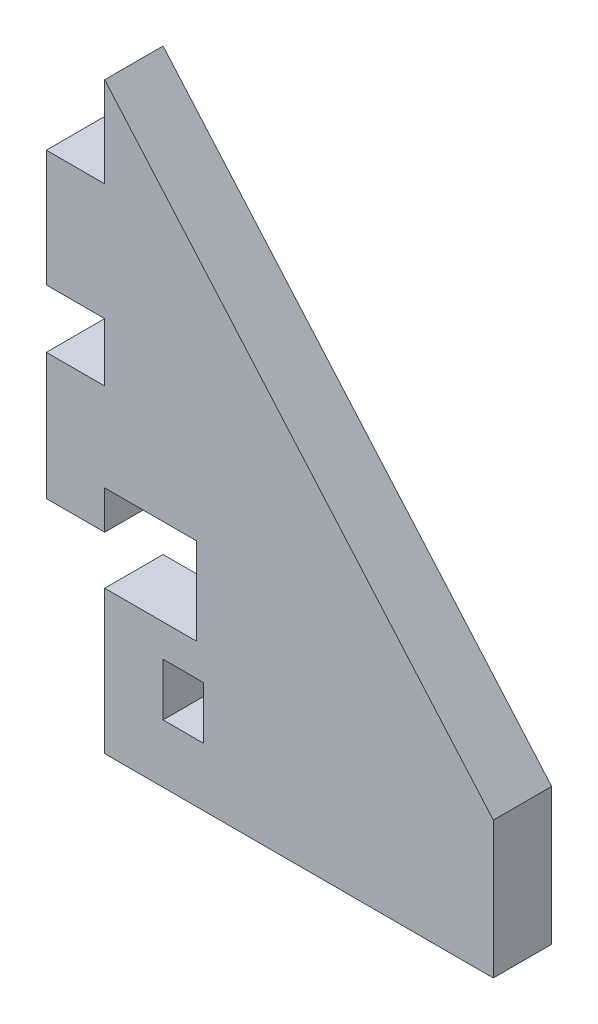
ISO-10303-21;
HEADER;
FILE_DESCRIPTION(('STEP AP214'),'2;1');
FILE_NAME('part.step','',(''),(''),'','','');
FILE_SCHEMA(('AUTOMOTIVE_DESIGN { 1 0 10303 214 1 1 1 1 }'));
ENDSEC;
DATA;
#1=APPLICATION_CONTEXT('core data for automotive mechanical design processes');
#2=APPLICATION_PROTOCOL_DEFINITION('international standard','automotive_design',2000,#1);
#3=PRODUCT_CONTEXT('',#1,'mechanical');
#4=PRODUCT('Part','Part','',(#3));
#5=PRODUCT_RELATED_PRODUCT_CATEGORY('part','',(#4));
#6=PRODUCT_DEFINITION_FORMATION('','',#4);
#7=PRODUCT_DEFINITION_CONTEXT('part definition',#1,'design');
#8=PRODUCT_DEFINITION('design','',#6,#7);
#9=PRODUCT_DEFINITION_SHAPE('','',#8);
#10=(LENGTH_UNIT() NAMED_UNIT(*) SI_UNIT(.MILLI.,.METRE.));
#11=(NAMED_UNIT(*) PLANE_ANGLE_UNIT() SI_UNIT($,.RADIAN.));
#12=(NAMED_UNIT(*) SI_UNIT($,.STERADIAN.) SOLID_ANGLE_UNIT());
#13=UNCERTAINTY_MEASURE_WITH_UNIT(LENGTH_MEASURE(1.E-05),#10,'distance_accuracy_value','');
#14=(GEOMETRIC_REPRESENTATION_CONTEXT(3) GLOBAL_UNCERTAINTY_ASSIGNED_CONTEXT((#13)) GLOBAL_UNIT_ASSIGNED_CONTEXT((#10,
#11,#12)) REPRESENTATION_CONTEXT('',''));
#15=CARTESIAN_POINT('',(0.,0.,0.));
#16=DIRECTION('',(0.,0.,1.));
#17=DIRECTION('',(1.,0.,0.));
#18=AXIS2_PLACEMENT_3D('',#15,#16,#17);
#19=CARTESIAN_POINT('',(-12.3466761252819,47.9124999999994,6.35));
#20=DIRECTION('',(1.,0.,0.));
#21=DIRECTION('',(0.,1.,0.));
#22=AXIS2_PLACEMENT_3D('',#19,#20,#21);
#23=PLANE('',#22);
#24=DIRECTION('',(0.,-1.,0.));
#25=VECTOR('',#24,1.);
#26=CARTESIAN_POINT('',(-12.3466761252819,47.9124999999994,0.));
#27=LINE('',#26,#25);
#28=CARTESIAN_POINT('',(-12.3466761252819,47.9124999999994,0.));
#29=VERTEX_POINT('',#28);
#30=CARTESIAN_POINT('',(-12.3466761252819,38.1,0.));
#31=VERTEX_POINT('',#30);
#32=EDGE_CURVE('E202',#29,#31,#27,.T.);
#33=ORIENTED_EDGE('',*,*,#32,.T.);
#34=DIRECTION('',(0.,0.,-1.));
#35=VECTOR('',#34,1.);
#36=CARTESIAN_POINT('',(-12.3466761252819,38.1,6.35));
#37=LINE('',#36,#35);
#38=CARTESIAN_POINT('',(-12.3466761252819,38.1,6.35));
#39=VERTEX_POINT('',#38);
#40=EDGE_CURVE('E11',#39,#31,#37,.T.);
#41=ORIENTED_EDGE('',*,*,#40,.F.);
#42=DIRECTION('',(0.,-1.,0.));
#43=VECTOR('',#42,1.);
#44=CARTESIAN_POINT('',(-12.3466761252819,47.9124999999994,6.35));
#45=LINE('',#44,#43);
#46=CARTESIAN_POINT('',(-12.3466761252819,47.9124999999994,6.35));
#47=VERTEX_POINT('',#46);
#48=EDGE_CURVE('E206',#47,#39,#45,.T.);
#49=ORIENTED_EDGE('',*,*,#48,.F.);
#50=DIRECTION('',(0.,0.,-1.));
#51=VECTOR('',#50,1.);
#52=CARTESIAN_POINT('',(-12.3466761252819,47.9124999999994,6.35));
#53=LINE('',#52,#51);
#54=EDGE_CURVE('E240',#47,#29,#53,.T.);
#55=ORIENTED_EDGE('',*,*,#54,.T.);
#56=EDGE_LOOP('',(#33,#41,#49,#55));
#57=FACE_BOUND('',#56,.T.);
#58=ADVANCED_FACE('F33',(#57),#23,.F.);
#59=CARTESIAN_POINT('',(-12.3466761252819,38.1,6.35));
#60=DIRECTION('',(0.,-1.,0.));
#61=DIRECTION('',(1.,0.,0.));
#62=AXIS2_PLACEMENT_3D('',#59,#60,#61);
#63=PLANE('',#62);
#64=DIRECTION('',(-1.,0.,0.));
#65=VECTOR('',#64,1.);
#66=CARTESIAN_POINT('',(-12.3466761252819,38.1,0.));
#67=LINE('',#66,#65);
#68=CARTESIAN_POINT('',(-18.6966761252819,38.1,0.));
#69=VERTEX_POINT('',#68);
#70=EDGE_CURVE('E243',#31,#69,#67,.T.);
#71=ORIENTED_EDGE('',*,*,#70,.T.);
#72=DIRECTION('',(0.,0.,-1.));
#73=VECTOR('',#72,1.);
#74=CARTESIAN_POINT('',(-18.6966761252819,38.1,6.35));
#75=LINE('',#74,#73);
#76=CARTESIAN_POINT('',(-18.6966761252819,38.1,6.35));
#77=VERTEX_POINT('',#76);
#78=EDGE_CURVE('E40',#77,#69,#75,.T.);
#79=ORIENTED_EDGE('',*,*,#78,.F.);
#80=DIRECTION('',(-1.,0.,0.));
#81=VECTOR('',#80,1.);
#82=CARTESIAN_POINT('',(-12.3466761252819,38.1,6.35));
#83=LINE('',#82,#81);
#84=EDGE_CURVE('E209',#39,#77,#83,.T.);
#85=ORIENTED_EDGE('',*,*,#84,.F.);
#86=ORIENTED_EDGE('',*,*,#40,.T.);
#87=EDGE_LOOP('',(#71,#79,#85,#86));
#88=FACE_BOUND('',#87,.T.);
#89=ADVANCED_FACE('F339',(#88),#63,.F.);
#90=CARTESIAN_POINT('',(-18.6966761252819,38.1,6.35));
#91=DIRECTION('',(1.,0.,0.));
#92=DIRECTION('',(0.,1.,0.));
#93=AXIS2_PLACEMENT_3D('',#90,#91,#92);
#94=PLANE('',#93);
#95=DIRECTION('',(0.,-1.,0.));
#96=VECTOR('',#95,1.);
#97=CARTESIAN_POINT('',(-18.6966761252819,38.1,0.));
#98=LINE('',#97,#96);
#99=CARTESIAN_POINT('',(-18.6966761252819,25.3999999999999,0.));
#100=VERTEX_POINT('',#99);
#101=EDGE_CURVE('E245',#69,#100,#98,.T.);
#102=ORIENTED_EDGE('',*,*,#101,.T.);
#103=DIRECTION('',(0.,0.,-1.));
#104=VECTOR('',#103,1.);
#105=CARTESIAN_POINT('',(-18.6966761252819,25.3999999999999,6.35));
#106=LINE('',#105,#104);
#107=CARTESIAN_POINT('',(-18.6966761252819,25.3999999999999,6.35));
#108=VERTEX_POINT('',#107);
#109=EDGE_CURVE('E311',#108,#100,#106,.T.);
#110=ORIENTED_EDGE('',*,*,#109,.F.);
#111=DIRECTION('',(0.,-1.,0.));
#112=VECTOR('',#111,1.);
#113=CARTESIAN_POINT('',(-18.6966761252819,38.1,6.35));
#114=LINE('',#113,#112);
#115=EDGE_CURVE('E212',#77,#108,#114,.T.);
#116=ORIENTED_EDGE('',*,*,#115,.F.);
#117=ORIENTED_EDGE('',*,*,#78,.T.);
#118=EDGE_LOOP('',(#102,#110,#116,#117));
#119=FACE_BOUND('',#118,.T.);
#120=ADVANCED_FACE('F318',(#119),#94,.F.);
#121=CARTESIAN_POINT('',(-18.6966761252819,25.3999999999999,6.35));
#122=DIRECTION('',(0.,1.,0.));
#123=DIRECTION('',(-1.,0.,0.));
#124=AXIS2_PLACEMENT_3D('',#121,#122,#123);
#125=PLANE('',#124);
#126=DIRECTION('',(1.,0.,0.));
#127=VECTOR('',#126,1.);
#128=CARTESIAN_POINT('',(-18.6966761252819,25.3999999999999,0.));
#129=LINE('',#128,#127);
#130=CARTESIAN_POINT('',(-12.3466761252819,25.3999999999999,0.));
#131=VERTEX_POINT('',#130);
#132=EDGE_CURVE('E247',#100,#131,#129,.T.);
#133=ORIENTED_EDGE('',*,*,#132,.T.);
#134=DIRECTION('',(0.,0.,-1.));
#135=VECTOR('',#134,1.);
#136=CARTESIAN_POINT('',(-12.3466761252819,25.3999999999999,6.35));
#137=LINE('',#136,#135);
#138=CARTESIAN_POINT('',(-12.3466761252819,25.3999999999999,6.35));
#139=VERTEX_POINT('',#138);
#140=EDGE_CURVE('E308',#139,#131,#137,.T.);
#141=ORIENTED_EDGE('',*,*,#140,.F.);
#142=DIRECTION('',(1.,0.,0.));
#143=VECTOR('',#142,1.);
#144=CARTESIAN_POINT('',(-18.6966761252819,25.3999999999999,6.35));
#145=LINE('',#144,#143);
#146=EDGE_CURVE('E214',#108,#139,#145,.T.);
#147=ORIENTED_EDGE('',*,*,#146,.F.);
#148=ORIENTED_EDGE('',*,*,#109,.T.);
#149=EDGE_LOOP('',(#133,#141,#147,#148));
#150=FACE_BOUND('',#149,.T.);
#151=ADVANCED_FACE('F329',(#150),#125,.F.);
#152=CARTESIAN_POINT('',(-12.3466761252819,25.3999999999999,6.35));
#153=DIRECTION('',(1.,0.,0.));
#154=DIRECTION('',(0.,1.,0.));
#155=AXIS2_PLACEMENT_3D('',#152,#153,#154);
#156=PLANE('',#155);
#157=DIRECTION('',(0.,-1.,0.));
#158=VECTOR('',#157,1.);
#159=CARTESIAN_POINT('',(-12.3466761252819,25.3999999999999,0.));
#160=LINE('',#159,#158);
#161=CARTESIAN_POINT('',(-12.3466761252819,19.05,0.));
#162=VERTEX_POINT('',#161);
#163=EDGE_CURVE('E249',#131,#162,#160,.T.);
#164=ORIENTED_EDGE('',*,*,#163,.T.);
#165=DIRECTION('',(0.,0.,-1.));
#166=VECTOR('',#165,1.);
#167=CARTESIAN_POINT('',(-12.3466761252819,19.05,6.35));
#168=LINE('',#167,#166);
#169=CARTESIAN_POINT('',(-12.3466761252819,19.05,6.35));
#170=VERTEX_POINT('',#169);
#171=EDGE_CURVE('E305',#170,#162,#168,.T.);
#172=ORIENTED_EDGE('',*,*,#171,.F.);
#173=DIRECTION('',(0.,-1.,0.));
#174=VECTOR('',#173,1.);
#175=CARTESIAN_POINT('',(-12.3466761252819,25.3999999999999,6.35));
#176=LINE('',#175,#174);
#177=EDGE_CURVE('E216',#139,#170,#176,.T.);
#178=ORIENTED_EDGE('',*,*,#177,.F.);
#179=ORIENTED_EDGE('',*,*,#140,.T.);
#180=EDGE_LOOP('',(#164,#172,#178,#179));
#181=FACE_BOUND('',#180,.T.);
#182=ADVANCED_FACE('F333',(#181),#156,.F.);
#183=CARTESIAN_POINT('',(-12.3466761252819,19.05,6.35));
#184=DIRECTION('',(0.,-1.,0.));
#185=DIRECTION('',(1.,0.,0.));
#186=AXIS2_PLACEMENT_3D('',#183,#184,#185);
#187=PLANE('',#186);
#188=DIRECTION('',(-1.,0.,0.));
#189=VECTOR('',#188,1.);
#190=CARTESIAN_POINT('',(-12.3466761252819,19.05,0.));
#191=LINE('',#190,#189);
#192=CARTESIAN_POINT('',(-18.696676125282,19.05,0.));
#193=VERTEX_POINT('',#192);
#194=EDGE_CURVE('E251',#162,#193,#191,.T.);
#195=ORIENTED_EDGE('',*,*,#194,.T.);
#196=DIRECTION('',(0.,0.,-1.));
#197=VECTOR('',#196,1.);
#198=CARTESIAN_POINT('',(-18.696676125282,19.05,6.35));
#199=LINE('',#198,#197);
#200=CARTESIAN_POINT('',(-18.696676125282,19.05,6.35));
#201=VERTEX_POINT('',#200);
#202=EDGE_CURVE('E302',#201,#193,#199,.T.);
#203=ORIENTED_EDGE('',*,*,#202,.F.);
#204=DIRECTION('',(-1.,0.,0.));
#205=VECTOR('',#204,1.);
#206=CARTESIAN_POINT('',(-12.3466761252819,19.05,6.35));
#207=LINE('',#206,#205);
#208=EDGE_CURVE('E218',#170,#201,#207,.T.);
#209=ORIENTED_EDGE('',*,*,#208,.F.);
#210=ORIENTED_EDGE('',*,*,#171,.T.);
#211=EDGE_LOOP('',(#195,#203,#209,#210));
#212=FACE_BOUND('',#211,.T.);
#213=ADVANCED_FACE('F391',(#212),#187,.F.);
#214=CARTESIAN_POINT('',(-18.696676125282,19.05,6.35));
#215=DIRECTION('',(1.,0.,0.));
#216=DIRECTION('',(0.,1.,0.));
#217=AXIS2_PLACEMENT_3D('',#214,#215,#216);
#218=PLANE('',#217);
#219=DIRECTION('',(0.,-1.,0.));
#220=VECTOR('',#219,1.);
#221=CARTESIAN_POINT('',(-18.696676125282,19.05,0.));
#222=LINE('',#221,#220);
#223=CARTESIAN_POINT('',(-18.696676125282,5.27049999999994,0.));
#224=VERTEX_POINT('',#223);
#225=EDGE_CURVE('E253',#193,#224,#222,.T.);
#226=ORIENTED_EDGE('',*,*,#225,.T.);
#227=DIRECTION('',(0.,0.,-1.));
#228=VECTOR('',#227,1.);
#229=CARTESIAN_POINT('',(-18.696676125282,5.27049999999994,6.35));
#230=LINE('',#229,#228);
#231=CARTESIAN_POINT('',(-18.696676125282,5.27049999999994,6.35));
#232=VERTEX_POINT('',#231);
#233=EDGE_CURVE('E299',#232,#224,#230,.T.);
#234=ORIENTED_EDGE('',*,*,#233,.F.);
#235=DIRECTION('',(0.,-1.,0.));
#236=VECTOR('',#235,1.);
#237=CARTESIAN_POINT('',(-18.696676125282,19.05,6.35));
#238=LINE('',#237,#236);
#239=EDGE_CURVE('E220',#201,#232,#238,.T.);
#240=ORIENTED_EDGE('',*,*,#239,.F.);
#241=ORIENTED_EDGE('',*,*,#202,.T.);
#242=EDGE_LOOP('',(#226,#234,#240,#241));
#243=FACE_BOUND('',#242,.T.);
#244=ADVANCED_FACE('F389',(#243),#218,.F.);
#245=CARTESIAN_POINT('',(-18.696676125282,5.27049999999994,6.35));
#246=DIRECTION('',(0.,1.,0.));
#247=DIRECTION('',(-1.,0.,0.));
#248=AXIS2_PLACEMENT_3D('',#245,#246,#247);
#249=PLANE('',#248);
#250=DIRECTION('',(1.,0.,0.));
#251=VECTOR('',#250,1.);
#252=CARTESIAN_POINT('',(-18.696676125282,5.27049999999994,0.));
#253=LINE('',#252,#251);
#254=CARTESIAN_POINT('',(-12.346676125282,5.27049999999993,0.));
#255=VERTEX_POINT('',#254);
#256=EDGE_CURVE('E255',#224,#255,#253,.T.);
#257=ORIENTED_EDGE('',*,*,#256,.T.);
#258=DIRECTION('',(0.,0.,-1.));
#259=VECTOR('',#258,1.);
#260=CARTESIAN_POINT('',(-12.346676125282,5.27049999999993,6.35));
#261=LINE('',#260,#259);
#262=CARTESIAN_POINT('',(-12.346676125282,5.27049999999993,6.35));
#263=VERTEX_POINT('',#262);
#264=EDGE_CURVE('E296',#263,#255,#261,.T.);
#265=ORIENTED_EDGE('',*,*,#264,.F.);
#266=DIRECTION('',(1.,0.,0.));
#267=VECTOR('',#266,1.);
#268=CARTESIAN_POINT('',(-18.696676125282,5.27049999999994,6.35));
#269=LINE('',#268,#267);
#270=EDGE_CURVE('E222',#232,#263,#269,.T.);
#271=ORIENTED_EDGE('',*,*,#270,.F.);
#272=ORIENTED_EDGE('',*,*,#233,.T.);
#273=EDGE_LOOP('',(#257,#265,#271,#272));
#274=FACE_BOUND('',#273,.T.);
#275=ADVANCED_FACE('F384',(#274),#249,.F.);
#276=CARTESIAN_POINT('',(-12.346676125282,5.27049999999993,6.35));
#277=DIRECTION('',(-1.,0.,0.));
#278=DIRECTION('',(0.,-1.,0.));
#279=AXIS2_PLACEMENT_3D('',#276,#277,#278);
#280=PLANE('',#279);
#281=DIRECTION('',(0.,1.,0.));
#282=VECTOR('',#281,1.);
#283=CARTESIAN_POINT('',(-12.346676125282,5.27049999999993,0.));
#284=LINE('',#283,#282);
#285=CARTESIAN_POINT('',(-12.346676125282,9.4557633513978,0.));
#286=VERTEX_POINT('',#285);
#287=EDGE_CURVE('E257',#255,#286,#284,.T.);
#288=ORIENTED_EDGE('',*,*,#287,.T.);
#289=DIRECTION('',(0.,0.,-1.));
#290=VECTOR('',#289,1.);
#291=CARTESIAN_POINT('',(-12.346676125282,9.4557633513978,6.35));
#292=LINE('',#291,#290);
#293=CARTESIAN_POINT('',(-12.346676125282,9.4557633513978,6.35));
#294=VERTEX_POINT('',#293);
#295=EDGE_CURVE('E293',#294,#286,#292,.T.);
#296=ORIENTED_EDGE('',*,*,#295,.F.);
#297=DIRECTION('',(0.,1.,0.));
#298=VECTOR('',#297,1.);
#299=CARTESIAN_POINT('',(-12.346676125282,5.27049999999993,6.35));
#300=LINE('',#299,#298);
#301=EDGE_CURVE('E224',#263,#294,#300,.T.);
#302=ORIENTED_EDGE('',*,*,#301,.F.);
#303=ORIENTED_EDGE('',*,*,#264,.T.);
#304=EDGE_LOOP('',(#288,#296,#302,#303));
#305=FACE_BOUND('',#304,.T.);
#306=ADVANCED_FACE('F379',(#305),#280,.F.);
#307=CARTESIAN_POINT('',(-2.34667612528206,9.4557633513978,6.35));
#308=DIRECTION('',(0.,1.,0.));
#309=DIRECTION('',(0.,0.,1.));
#310=AXIS2_PLACEMENT_3D('',#307,#308,#309);
#311=PLANE('',#310);
#312=DIRECTION('',(1.,0.,0.));
#313=VECTOR('',#312,1.);
#314=CARTESIAN_POINT('',(-2.34667612528206,9.4557633513978,0.));
#315=LINE('',#314,#313);
#316=CARTESIAN_POINT('',(-2.34667612528206,9.4557633513978,0.));
#317=VERTEX_POINT('',#316);
#318=EDGE_CURVE('E259',#286,#317,#315,.T.);
#319=ORIENTED_EDGE('',*,*,#318,.T.);
#320=DIRECTION('',(0.,0.,-1.));
#321=VECTOR('',#320,1.);
#322=CARTESIAN_POINT('',(-2.34667612528206,9.4557633513978,6.35));
#323=LINE('',#322,#321);
#324=CARTESIAN_POINT('',(-2.34667612528206,9.4557633513978,6.35));
#325=VERTEX_POINT('',#324);
#326=EDGE_CURVE('E290',#325,#317,#323,.T.);
#327=ORIENTED_EDGE('',*,*,#326,.F.);
#328=DIRECTION('',(1.,0.,0.));
#329=VECTOR('',#328,1.);
#330=CARTESIAN_POINT('',(-2.34667612528206,9.4557633513978,6.35));
#331=LINE('',#330,#329);
#332=EDGE_CURVE('E226',#294,#325,#331,.T.);
#333=ORIENTED_EDGE('',*,*,#332,.F.);
#334=ORIENTED_EDGE('',*,*,#295,.T.);
#335=EDGE_LOOP('',(#319,#327,#333,#334));
#336=FACE_BOUND('',#335,.T.);
#337=ADVANCED_FACE('F374',(#336),#311,.F.);
#338=CARTESIAN_POINT('',(-2.34667612528206,5.27049999999994,6.35));
#339=DIRECTION('',(1.,0.,0.));
#340=DIRECTION('',(0.,1.,0.));
#341=AXIS2_PLACEMENT_3D('',#338,#339,#340);
#342=PLANE('',#341);
#343=DIRECTION('',(0.,-1.,0.));
#344=VECTOR('',#343,1.);
#345=CARTESIAN_POINT('',(-2.34667612528206,5.27049999999994,0.));
#346=LINE('',#345,#344);
#347=CARTESIAN_POINT('',(-2.34667612528206,0.,0.));
#348=VERTEX_POINT('',#347);
#349=EDGE_CURVE('E262',#317,#348,#346,.T.);
#350=ORIENTED_EDGE('',*,*,#349,.T.);
#351=DIRECTION('',(0.,0.,-1.));
#352=VECTOR('',#351,1.);
#353=CARTESIAN_POINT('',(-2.34667612528206,0.,6.35));
#354=LINE('',#353,#352);
#355=CARTESIAN_POINT('',(-2.34667612528206,0.,6.35));
#356=VERTEX_POINT('',#355);
#357=EDGE_CURVE('E287',#356,#348,#354,.T.);
#358=ORIENTED_EDGE('',*,*,#357,.F.);
#359=DIRECTION('',(0.,-1.,0.));
#360=VECTOR('',#359,1.);
#361=CARTESIAN_POINT('',(-2.34667612528206,5.27049999999994,6.35));
#362=LINE('',#361,#360);
#363=EDGE_CURVE('E228',#325,#356,#362,.T.);
#364=ORIENTED_EDGE('',*,*,#363,.F.);
#365=ORIENTED_EDGE('',*,*,#326,.T.);
#366=EDGE_LOOP('',(#350,#358,#364,#365));
#367=FACE_BOUND('',#366,.T.);
#368=ADVANCED_FACE('F369',(#367),#342,.F.);
#369=CARTESIAN_POINT('',(-2.34667612528206,0.,6.35));
#370=DIRECTION('',(0.,-1.,0.));
#371=DIRECTION('',(1.,0.,0.));
#372=AXIS2_PLACEMENT_3D('',#369,#370,#371);
#373=PLANE('',#372);
#374=DIRECTION('',(-1.,0.,0.));
#375=VECTOR('',#374,1.);
#376=CARTESIAN_POINT('',(-2.34667612528206,0.,0.));
#377=LINE('',#376,#375);
#378=CARTESIAN_POINT('',(-12.3466761252821,4.34068587516324E-13,0.));
#379=VERTEX_POINT('',#378);
#380=EDGE_CURVE('E264',#348,#379,#377,.T.);
#381=ORIENTED_EDGE('',*,*,#380,.T.);
#382=DIRECTION('',(0.,0.,-1.));
#383=VECTOR('',#382,1.);
#384=CARTESIAN_POINT('',(-12.3466761252821,4.34068587516324E-13,6.35));
#385=LINE('',#384,#383);
#386=CARTESIAN_POINT('',(-12.3466761252821,4.34068587516324E-13,6.35));
#387=VERTEX_POINT('',#386);
#388=EDGE_CURVE('E284',#387,#379,#385,.T.);
#389=ORIENTED_EDGE('',*,*,#388,.F.);
#390=DIRECTION('',(-1.,0.,0.));
#391=VECTOR('',#390,1.);
#392=CARTESIAN_POINT('',(-2.34667612528206,0.,6.35));
#393=LINE('',#392,#391);
#394=EDGE_CURVE('E230',#356,#387,#393,.T.);
#395=ORIENTED_EDGE('',*,*,#394,.F.);
#396=ORIENTED_EDGE('',*,*,#357,.T.);
#397=EDGE_LOOP('',(#381,#389,#395,#396));
#398=FACE_BOUND('',#397,.T.);
#399=ADVANCED_FACE('F365',(#398),#373,.F.);
#400=CARTESIAN_POINT('',(-12.3466761252821,4.34068587516324E-13,6.35));
#401=DIRECTION('',(1.,0.,0.));
#402=DIRECTION('',(0.,1.,0.));
#403=AXIS2_PLACEMENT_3D('',#400,#401,#402);
#404=PLANE('',#403);
#405=DIRECTION('',(0.,-1.,0.));
#406=VECTOR('',#405,1.);
#407=CARTESIAN_POINT('',(-12.3466761252821,4.34068587516324E-13,0.));
#408=LINE('',#407,#406);
#409=CARTESIAN_POINT('',(-12.346676125282,-15.5875,0.));
#410=VERTEX_POINT('',#409);
#411=EDGE_CURVE('E266',#379,#410,#408,.T.);
#412=ORIENTED_EDGE('',*,*,#411,.T.);
#413=DIRECTION('',(0.,0.,-1.));
#414=VECTOR('',#413,1.);
#415=CARTESIAN_POINT('',(-12.346676125282,-15.5875,6.35));
#416=LINE('',#415,#414);
#417=CARTESIAN_POINT('',(-12.346676125282,-15.5875,6.35));
#418=VERTEX_POINT('',#417);
#419=EDGE_CURVE('E281',#418,#410,#416,.T.);
#420=ORIENTED_EDGE('',*,*,#419,.F.);
#421=DIRECTION('',(0.,-1.,0.));
#422=VECTOR('',#421,1.);
#423=CARTESIAN_POINT('',(-12.3466761252821,4.34068587516324E-13,6.35));
#424=LINE('',#423,#422);
#425=EDGE_CURVE('E232',#387,#418,#424,.T.);
#426=ORIENTED_EDGE('',*,*,#425,.F.);
#427=ORIENTED_EDGE('',*,*,#388,.T.);
#428=EDGE_LOOP('',(#412,#420,#426,#427));
#429=FACE_BOUND('',#428,.T.);
#430=ADVANCED_FACE('F360',(#429),#404,.F.);
#431=CARTESIAN_POINT('',(-12.346676125282,-15.5875,6.35));
#432=DIRECTION('',(0.,1.,0.));
#433=DIRECTION('',(-1.,0.,0.));
#434=AXIS2_PLACEMENT_3D('',#431,#432,#433);
#435=PLANE('',#434);
#436=DIRECTION('',(1.,0.,0.));
#437=VECTOR('',#436,1.);
#438=CARTESIAN_POINT('',(-12.346676125282,-15.5875,0.));
#439=LINE('',#438,#437);
#440=CARTESIAN_POINT('',(29.9353302305423,-15.5875000000002,0.));
#441=VERTEX_POINT('',#440);
#442=EDGE_CURVE('E268',#410,#441,#439,.T.);
#443=ORIENTED_EDGE('',*,*,#442,.T.);
#444=DIRECTION('',(0.,0.,-1.));
#445=VECTOR('',#444,1.);
#446=CARTESIAN_POINT('',(29.9353302305423,-15.5875000000002,6.35));
#447=LINE('',#446,#445);
#448=CARTESIAN_POINT('',(29.9353302305423,-15.5875000000002,6.35));
#449=VERTEX_POINT('',#448);
#450=EDGE_CURVE('E278',#449,#441,#447,.T.);
#451=ORIENTED_EDGE('',*,*,#450,.F.);
#452=DIRECTION('',(1.,0.,0.));
#453=VECTOR('',#452,1.);
#454=CARTESIAN_POINT('',(-12.346676125282,-15.5875,6.35));
#455=LINE('',#454,#453);
#456=EDGE_CURVE('E234',#418,#449,#455,.T.);
#457=ORIENTED_EDGE('',*,*,#456,.F.);
#458=ORIENTED_EDGE('',*,*,#419,.T.);
#459=EDGE_LOOP('',(#443,#451,#457,#458));
#460=FACE_BOUND('',#459,.T.);
#461=ADVANCED_FACE('F355',(#460),#435,.F.);
#462=CARTESIAN_POINT('',(29.9353302305423,-15.5875000000002,6.35));
#463=DIRECTION('',(-1.,0.,0.));
#464=DIRECTION('',(0.,0.,1.));
#465=AXIS2_PLACEMENT_3D('',#462,#463,#464);
#466=PLANE('',#465);
#467=DIRECTION('',(0.,1.,0.));
#468=VECTOR('',#467,1.);
#469=CARTESIAN_POINT('',(29.9353302305423,-15.5875000000002,0.));
#470=LINE('',#469,#468);
#471=CARTESIAN_POINT('',(29.9353302305423,-0.710514445890658,0.));
#472=VERTEX_POINT('',#471);
#473=EDGE_CURVE('E270',#441,#472,#470,.T.);
#474=ORIENTED_EDGE('',*,*,#473,.T.);
#475=DIRECTION('',(0.,0.,-1.));
#476=VECTOR('',#475,1.);
#477=CARTESIAN_POINT('',(29.9353302305423,-0.710514445890658,6.35));
#478=LINE('',#477,#476);
#479=CARTESIAN_POINT('',(29.9353302305423,-0.710514445890658,6.35));
#480=VERTEX_POINT('',#479);
#481=EDGE_CURVE('E275',#480,#472,#478,.T.);
#482=ORIENTED_EDGE('',*,*,#481,.F.);
#483=DIRECTION('',(0.,1.,0.));
#484=VECTOR('',#483,1.);
#485=CARTESIAN_POINT('',(29.9353302305423,-15.5875000000002,6.35));
#486=LINE('',#485,#484);
#487=EDGE_CURVE('E236',#449,#480,#486,.T.);
#488=ORIENTED_EDGE('',*,*,#487,.F.);
#489=ORIENTED_EDGE('',*,*,#450,.T.);
#490=EDGE_LOOP('',(#474,#482,#488,#489));
#491=FACE_BOUND('',#490,.T.);
#492=ADVANCED_FACE('F351',(#491),#466,.F.);
#493=CARTESIAN_POINT('',(29.9353302305423,-0.710514445890658,6.35));
#494=DIRECTION('',(-0.754596882968002,-0.656188649867533,0.));
#495=DIRECTION('',(0.656188649867533,-0.754596882968002,0.));
#496=AXIS2_PLACEMENT_3D('',#493,#494,#495);
#497=PLANE('',#496);
#498=DIRECTION('',(-0.656188649867533,0.754596882968002,0.));
#499=VECTOR('',#498,1.);
#500=CARTESIAN_POINT('',(29.9353302305423,-0.710514445890658,0.));
#501=LINE('',#500,#499);
#502=EDGE_CURVE('E210',#472,#29,#501,.T.);
#503=ORIENTED_EDGE('',*,*,#502,.T.);
#504=ORIENTED_EDGE('',*,*,#54,.F.);
#505=DIRECTION('',(-0.656188649867533,0.754596882968002,0.));
#506=VECTOR('',#505,1.);
#507=CARTESIAN_POINT('',(29.9353302305423,-0.710514445890658,6.35));
#508=LINE('',#507,#506);
#509=EDGE_CURVE('E238',#480,#47,#508,.T.);
#510=ORIENTED_EDGE('',*,*,#509,.F.);
#511=ORIENTED_EDGE('',*,*,#481,.T.);
#512=EDGE_LOOP('',(#503,#504,#510,#511));
#513=FACE_BOUND('',#512,.T.);
#514=ADVANCED_FACE('F346',(#513),#497,.F.);
#515=CARTESIAN_POINT('',(0.,0.,6.35));
#516=DIRECTION('',(0.,0.,-1.));
#517=DIRECTION('',(-1.,0.,0.));
#518=AXIS2_PLACEMENT_3D('',#515,#516,#517);
#519=PLANE('',#518);
#520=DIRECTION('',(-1.,0.,0.));
#521=VECTOR('',#520,1.);
#522=CARTESIAN_POINT('',(-5.99667612528206,-9.23750000000002,6.35));
#523=LINE('',#522,#521);
#524=CARTESIAN_POINT('',(-1.59667612528206,-9.23750000000002,6.35));
#525=VERTEX_POINT('',#524);
#526=CARTESIAN_POINT('',(-5.99667612528206,-9.23750000000002,6.35));
#527=VERTEX_POINT('',#526);
#528=EDGE_CURVE('E177',#525,#527,#523,.T.);
#529=ORIENTED_EDGE('',*,*,#528,.T.);
#530=DIRECTION('',(0.,1.,0.));
#531=VECTOR('',#530,1.);
#532=CARTESIAN_POINT('',(-5.99667612528206,-9.23750000000002,6.35));
#533=LINE('',#532,#531);
#534=CARTESIAN_POINT('',(-5.99667612528206,-3.51750000000002,6.35));
#535=VERTEX_POINT('',#534);
#536=EDGE_CURVE('E171',#527,#535,#533,.T.);
#537=ORIENTED_EDGE('',*,*,#536,.T.);
#538=DIRECTION('',(1.,0.,0.));
#539=VECTOR('',#538,1.);
#540=CARTESIAN_POINT('',(-5.99667612528206,-3.51750000000002,6.35));
#541=LINE('',#540,#539);
#542=CARTESIAN_POINT('',(-1.59667612528206,-3.51750000000002,6.35));
#543=VERTEX_POINT('',#542);
#544=EDGE_CURVE('E180',#535,#543,#541,.T.);
#545=ORIENTED_EDGE('',*,*,#544,.T.);
#546=DIRECTION('',(0.,-1.,0.));
#547=VECTOR('',#546,1.);
#548=CARTESIAN_POINT('',(-1.59667612528206,-9.23750000000002,6.35));
#549=LINE('',#548,#547);
#550=EDGE_CURVE('E47',#543,#525,#549,.T.);
#551=ORIENTED_EDGE('',*,*,#550,.T.);
#552=EDGE_LOOP('',(#529,#537,#545,#551));
#553=FACE_BOUND('',#552,.T.);
#554=ORIENTED_EDGE('',*,*,#48,.T.);
#555=ORIENTED_EDGE('',*,*,#84,.T.);
#556=ORIENTED_EDGE('',*,*,#115,.T.);
#557=ORIENTED_EDGE('',*,*,#146,.T.);
#558=ORIENTED_EDGE('',*,*,#177,.T.);
#559=ORIENTED_EDGE('',*,*,#208,.T.);
#560=ORIENTED_EDGE('',*,*,#239,.T.);
#561=ORIENTED_EDGE('',*,*,#270,.T.);
#562=ORIENTED_EDGE('',*,*,#301,.T.);
#563=ORIENTED_EDGE('',*,*,#332,.T.);
#564=ORIENTED_EDGE('',*,*,#363,.T.);
#565=ORIENTED_EDGE('',*,*,#394,.T.);
#566=ORIENTED_EDGE('',*,*,#425,.T.);
#567=ORIENTED_EDGE('',*,*,#456,.T.);
#568=ORIENTED_EDGE('',*,*,#487,.T.);
#569=ORIENTED_EDGE('',*,*,#509,.T.);
#570=EDGE_LOOP('',(#554,#555,#556,#557,#558,#559,#560,#561,#562,#563,#564,#565,#566,#567,#568,#569));
#571=FACE_BOUND('',#570,.T.);
#572=ADVANCED_FACE('F184',(#553,#571),#519,.F.);
#573=CARTESIAN_POINT('',(0.,0.,0.));
#574=DIRECTION('',(0.,0.,-1.));
#575=DIRECTION('',(-1.,0.,0.));
#576=AXIS2_PLACEMENT_3D('',#573,#574,#575);
#577=PLANE('',#576);
#578=DIRECTION('',(0.,1.,0.));
#579=VECTOR('',#578,1.);
#580=CARTESIAN_POINT('',(-5.99667612528206,-9.23750000000002,0.));
#581=LINE('',#580,#579);
#582=CARTESIAN_POINT('',(-5.99667612528206,-9.23750000000002,0.));
#583=VERTEX_POINT('',#582);
#584=CARTESIAN_POINT('',(-5.99667612528206,-3.51750000000002,0.));
#585=VERTEX_POINT('',#584);
#586=EDGE_CURVE('E55',#583,#585,#581,.T.);
#587=ORIENTED_EDGE('',*,*,#586,.F.);
#588=DIRECTION('',(-1.,0.,0.));
#589=VECTOR('',#588,1.);
#590=CARTESIAN_POINT('',(-5.99667612528206,-9.23750000000002,0.));
#591=LINE('',#590,#589);
#592=CARTESIAN_POINT('',(-1.59667612528206,-9.23750000000002,0.));
#593=VERTEX_POINT('',#592);
#594=EDGE_CURVE('E187',#593,#583,#591,.T.);
#595=ORIENTED_EDGE('',*,*,#594,.F.);
#596=DIRECTION('',(0.,-1.,0.));
#597=VECTOR('',#596,1.);
#598=CARTESIAN_POINT('',(-1.59667612528206,-9.23750000000002,0.));
#599=LINE('',#598,#597);
#600=CARTESIAN_POINT('',(-1.59667612528206,-3.51750000000002,0.));
#601=VERTEX_POINT('',#600);
#602=EDGE_CURVE('E190',#601,#593,#599,.T.);
#603=ORIENTED_EDGE('',*,*,#602,.F.);
#604=DIRECTION('',(1.,0.,0.));
#605=VECTOR('',#604,1.);
#606=CARTESIAN_POINT('',(-5.99667612528206,-3.51750000000002,0.));
#607=LINE('',#606,#605);
#608=EDGE_CURVE('E196',#585,#601,#607,.T.);
#609=ORIENTED_EDGE('',*,*,#608,.F.);
#610=EDGE_LOOP('',(#587,#595,#603,#609));
#611=FACE_BOUND('',#610,.T.);
#612=ORIENTED_EDGE('',*,*,#32,.F.);
#613=ORIENTED_EDGE('',*,*,#502,.F.);
#614=ORIENTED_EDGE('',*,*,#473,.F.);
#615=ORIENTED_EDGE('',*,*,#442,.F.);
#616=ORIENTED_EDGE('',*,*,#411,.F.);
#617=ORIENTED_EDGE('',*,*,#380,.F.);
#618=ORIENTED_EDGE('',*,*,#349,.F.);
#619=ORIENTED_EDGE('',*,*,#318,.F.);
#620=ORIENTED_EDGE('',*,*,#287,.F.);
#621=ORIENTED_EDGE('',*,*,#256,.F.);
#622=ORIENTED_EDGE('',*,*,#225,.F.);
#623=ORIENTED_EDGE('',*,*,#194,.F.);
#624=ORIENTED_EDGE('',*,*,#163,.F.);
#625=ORIENTED_EDGE('',*,*,#132,.F.);
#626=ORIENTED_EDGE('',*,*,#101,.F.);
#627=ORIENTED_EDGE('',*,*,#70,.F.);
#628=EDGE_LOOP('',(#612,#613,#614,#615,#616,#617,#618,#619,#620,#621,#622,#623,#624,#625,#626,#627));
#629=FACE_BOUND('',#628,.T.);
#630=ADVANCED_FACE('F324',(#611,#629),#577,.T.);
#631=CARTESIAN_POINT('',(-5.99667612528206,-9.23750000000002,6.35));
#632=DIRECTION('',(-1.,0.,0.));
#633=DIRECTION('',(0.,0.,1.));
#634=AXIS2_PLACEMENT_3D('',#631,#632,#633);
#635=PLANE('',#634);
#636=ORIENTED_EDGE('',*,*,#586,.T.);
#637=DIRECTION('',(0.,0.,-1.));
#638=VECTOR('',#637,1.);
#639=CARTESIAN_POINT('',(-5.99667612528206,-3.51750000000002,6.35));
#640=LINE('',#639,#638);
#641=EDGE_CURVE('E167',#535,#585,#640,.T.);
#642=ORIENTED_EDGE('',*,*,#641,.F.);
#643=ORIENTED_EDGE('',*,*,#536,.F.);
#644=DIRECTION('',(0.,0.,-1.));
#645=VECTOR('',#644,1.);
#646=CARTESIAN_POINT('',(-5.99667612528206,-9.23750000000002,6.35));
#647=LINE('',#646,#645);
#648=EDGE_CURVE('E200',#527,#583,#647,.T.);
#649=ORIENTED_EDGE('',*,*,#648,.T.);
#650=EDGE_LOOP('',(#636,#642,#643,#649));
#651=FACE_BOUND('',#650,.T.);
#652=ADVANCED_FACE('F169',(#651),#635,.F.);
#653=CARTESIAN_POINT('',(-5.99667612528206,-9.23750000000002,6.35));
#654=DIRECTION('',(0.,-1.,0.));
#655=DIRECTION('',(0.,0.,-1.));
#656=AXIS2_PLACEMENT_3D('',#653,#654,#655);
#657=PLANE('',#656);
#658=ORIENTED_EDGE('',*,*,#594,.T.);
#659=ORIENTED_EDGE('',*,*,#648,.F.);
#660=ORIENTED_EDGE('',*,*,#528,.F.);
#661=DIRECTION('',(0.,0.,-1.));
#662=VECTOR('',#661,1.);
#663=CARTESIAN_POINT('',(-1.59667612528206,-9.23750000000002,6.35));
#664=LINE('',#663,#662);
#665=EDGE_CURVE('E203',#525,#593,#664,.T.);
#666=ORIENTED_EDGE('',*,*,#665,.T.);
#667=EDGE_LOOP('',(#658,#659,#660,#666));
#668=FACE_BOUND('',#667,.T.);
#669=ADVANCED_FACE('F523',(#668),#657,.F.);
#670=CARTESIAN_POINT('',(-1.59667612528206,-9.23750000000002,6.35));
#671=DIRECTION('',(1.,0.,0.));
#672=DIRECTION('',(0.,0.,-1.));
#673=AXIS2_PLACEMENT_3D('',#670,#671,#672);
#674=PLANE('',#673);
#675=ORIENTED_EDGE('',*,*,#602,.T.);
#676=ORIENTED_EDGE('',*,*,#665,.F.);
#677=ORIENTED_EDGE('',*,*,#550,.F.);
#678=DIRECTION('',(0.,0.,-1.));
#679=VECTOR('',#678,1.);
#680=CARTESIAN_POINT('',(-1.59667612528206,-3.51750000000002,6.35));
#681=LINE('',#680,#679);
#682=EDGE_CURVE('E176',#543,#601,#681,.T.);
#683=ORIENTED_EDGE('',*,*,#682,.T.);
#684=EDGE_LOOP('',(#675,#676,#677,#683));
#685=FACE_BOUND('',#684,.T.);
#686=ADVANCED_FACE('F532',(#685),#674,.F.);
#687=CARTESIAN_POINT('',(-5.99667612528206,-3.51750000000002,6.35));
#688=DIRECTION('',(0.,1.,0.));
#689=DIRECTION('',(-1.,0.,0.));
#690=AXIS2_PLACEMENT_3D('',#687,#688,#689);
#691=PLANE('',#690);
#692=ORIENTED_EDGE('',*,*,#608,.T.);
#693=ORIENTED_EDGE('',*,*,#682,.F.);
#694=ORIENTED_EDGE('',*,*,#544,.F.);
#695=ORIENTED_EDGE('',*,*,#641,.T.);
#696=EDGE_LOOP('',(#692,#693,#694,#695));
#697=FACE_BOUND('',#696,.T.);
#698=ADVANCED_FACE('F181',(#697),#691,.F.);
#699=CLOSED_SHELL('',(#58,#89,#120,#151,#182,#213,#244,#275,#306,#337,#368,#399,#430,#461,#492,
#514,#572,#630,#652,#669,#686,#698));
#700=MANIFOLD_SOLID_BREP('B2',#699);
#701=ADVANCED_BREP_SHAPE_REPRESENTATION('',(#18,#700),#14);
#702=SHAPE_DEFINITION_REPRESENTATION(#9,#701);
ENDSEC;
END-ISO-10303-21;
